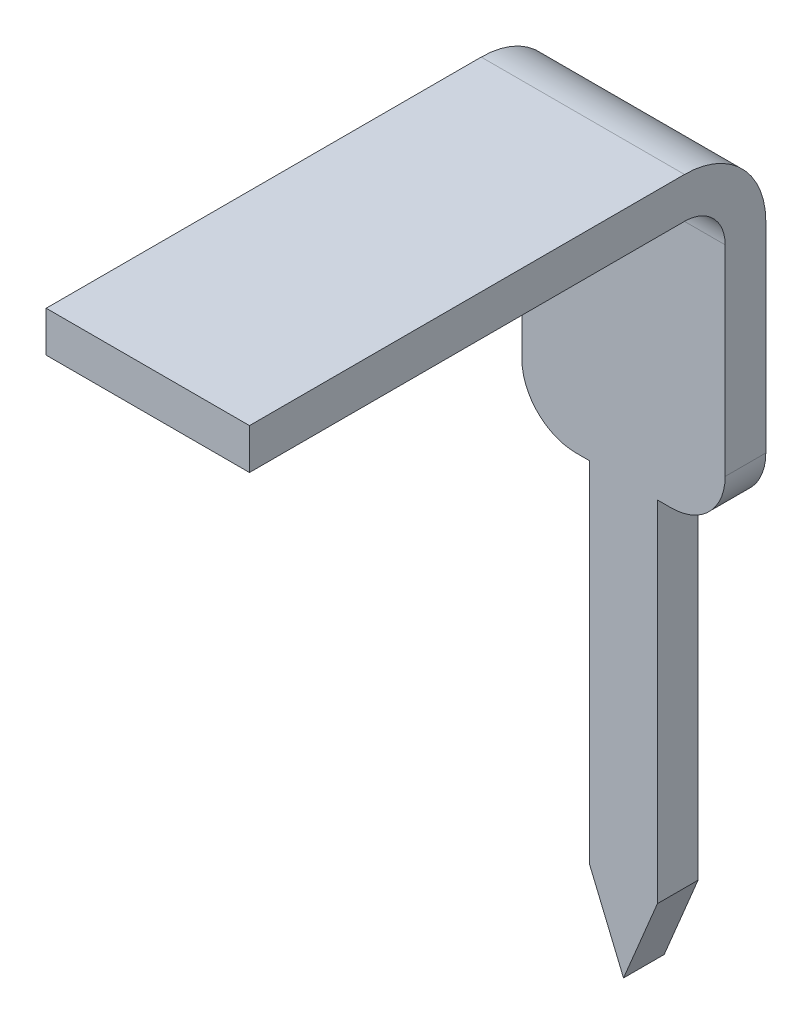
ISO-10303-21;
HEADER;
FILE_DESCRIPTION(('STEP AP214'),'2;1');
FILE_NAME('part.step','',(''),(''),'','','');
FILE_SCHEMA(('AUTOMOTIVE_DESIGN { 1 0 10303 214 1 1 1 1 }'));
ENDSEC;
DATA;
#1=APPLICATION_CONTEXT('core data for automotive mechanical design processes');
#2=APPLICATION_PROTOCOL_DEFINITION('international standard','automotive_design',2000,#1);
#3=PRODUCT_CONTEXT('',#1,'mechanical');
#4=PRODUCT('Part','Part','',(#3));
#5=PRODUCT_RELATED_PRODUCT_CATEGORY('part','',(#4));
#6=PRODUCT_DEFINITION_FORMATION('','',#4);
#7=PRODUCT_DEFINITION_CONTEXT('part definition',#1,'design');
#8=PRODUCT_DEFINITION('design','',#6,#7);
#9=PRODUCT_DEFINITION_SHAPE('','',#8);
#10=(LENGTH_UNIT() NAMED_UNIT(*) SI_UNIT(.MILLI.,.METRE.));
#11=(NAMED_UNIT(*) PLANE_ANGLE_UNIT() SI_UNIT($,.RADIAN.));
#12=(NAMED_UNIT(*) SI_UNIT($,.STERADIAN.) SOLID_ANGLE_UNIT());
#13=UNCERTAINTY_MEASURE_WITH_UNIT(LENGTH_MEASURE(1.E-05),#10,'distance_accuracy_value','');
#14=(GEOMETRIC_REPRESENTATION_CONTEXT(3) GLOBAL_UNCERTAINTY_ASSIGNED_CONTEXT((#13)) GLOBAL_UNIT_ASSIGNED_CONTEXT((#10,
#11,#12)) REPRESENTATION_CONTEXT('',''));
#15=CARTESIAN_POINT('',(0.,0.,0.));
#16=DIRECTION('',(0.,0.,1.));
#17=DIRECTION('',(1.,0.,0.));
#18=AXIS2_PLACEMENT_3D('',#15,#16,#17);
#19=CARTESIAN_POINT('',(2.78,-0.299999999999998,-0.170000000000001));
#20=DIRECTION('',(0.,0.,-1.));
#21=DIRECTION('',(-1.,0.,0.));
#22=AXIS2_PLACEMENT_3D('',#19,#20,#21);
#23=PLANE('',#22);
#24=DIRECTION('',(-1.,0.,0.));
#25=VECTOR('',#24,1.);
#26=CARTESIAN_POINT('',(2.78,-2.48,-0.170000000000001));
#27=LINE('',#26,#25);
#28=CARTESIAN_POINT('',(1.78,-2.48,-0.17));
#29=VERTEX_POINT('',#28);
#30=CARTESIAN_POINT('',(1.68,-2.48,-0.170000000000001));
#31=VERTEX_POINT('',#30);
#32=EDGE_CURVE('E100',#29,#31,#27,.T.);
#33=ORIENTED_EDGE('',*,*,#32,.F.);
#34=DIRECTION('',(0.,1.,0.));
#35=VECTOR('',#34,1.);
#36=CARTESIAN_POINT('',(1.78,-5.06,-0.17));
#37=LINE('',#36,#35);
#38=CARTESIAN_POINT('',(1.78,-5.06,-0.17));
#39=VERTEX_POINT('',#38);
#40=EDGE_CURVE('E132',#39,#29,#37,.T.);
#41=ORIENTED_EDGE('',*,*,#40,.F.);
#42=DIRECTION('',(0.384615384615385,-0.923076923076923,0.));
#43=VECTOR('',#42,1.);
#44=CARTESIAN_POINT('',(2.03,-5.66,-0.17));
#45=LINE('',#44,#43);
#46=CARTESIAN_POINT('',(2.03,-5.66,-0.17));
#47=VERTEX_POINT('',#46);
#48=EDGE_CURVE('E128',#47,#39,#45,.F.);
#49=ORIENTED_EDGE('',*,*,#48,.F.);
#50=DIRECTION('',(0.384615384615385,0.923076923076923,0.));
#51=VECTOR('',#50,1.);
#52=CARTESIAN_POINT('',(2.28,-5.06,-0.17));
#53=LINE('',#52,#51);
#54=CARTESIAN_POINT('',(2.28,-5.06,-0.17));
#55=VERTEX_POINT('',#54);
#56=EDGE_CURVE('E171',#55,#47,#53,.F.);
#57=ORIENTED_EDGE('',*,*,#56,.F.);
#58=DIRECTION('',(0.,1.,0.));
#59=VECTOR('',#58,1.);
#60=CARTESIAN_POINT('',(2.28,-2.48,-0.17));
#61=LINE('',#60,#59);
#62=CARTESIAN_POINT('',(2.28,-2.48,-0.17));
#63=VERTEX_POINT('',#62);
#64=EDGE_CURVE('E96',#63,#55,#61,.F.);
#65=ORIENTED_EDGE('',*,*,#64,.F.);
#66=DIRECTION('',(-1.,0.,0.));
#67=VECTOR('',#66,1.);
#68=CARTESIAN_POINT('',(2.78,-2.48,-0.170000000000001));
#69=LINE('',#68,#67);
#70=CARTESIAN_POINT('',(2.38,-2.48,-0.170000000000001));
#71=VERTEX_POINT('',#70);
#72=EDGE_CURVE('E91',#71,#63,#69,.T.);
#73=ORIENTED_EDGE('',*,*,#72,.F.);
#74=CARTESIAN_POINT('',(2.38,-2.08,-0.17));
#75=DIRECTION('',(0.,0.,-1.));
#76=DIRECTION('',(-1.,0.,0.));
#77=AXIS2_PLACEMENT_3D('',#74,#75,#76);
#78=CIRCLE('',#77,0.4);
#79=CARTESIAN_POINT('',(2.78,-2.08,-0.170000000000001));
#80=VERTEX_POINT('',#79);
#81=EDGE_CURVE('E18',#80,#71,#78,.T.);
#82=ORIENTED_EDGE('',*,*,#81,.F.);
#83=DIRECTION('',(0.,1.,0.));
#84=VECTOR('',#83,1.);
#85=CARTESIAN_POINT('',(2.78,-0.299999999999998,-0.170000000000001));
#86=LINE('',#85,#84);
#87=CARTESIAN_POINT('',(2.78,-0.599999999999998,-0.170000000000001));
#88=VERTEX_POINT('',#87);
#89=EDGE_CURVE('E117',#88,#80,#86,.F.);
#90=ORIENTED_EDGE('',*,*,#89,.F.);
#91=DIRECTION('',(-1.,0.,0.));
#92=VECTOR('',#91,1.);
#93=CARTESIAN_POINT('',(2.78,-0.599999999999999,-0.170000000000001));
#94=LINE('',#93,#92);
#95=CARTESIAN_POINT('',(1.28,-0.599999999999999,-0.170000000000001));
#96=VERTEX_POINT('',#95);
#97=EDGE_CURVE('E118',#96,#88,#94,.F.);
#98=ORIENTED_EDGE('',*,*,#97,.F.);
#99=DIRECTION('',(0.,1.,0.));
#100=VECTOR('',#99,1.);
#101=CARTESIAN_POINT('',(1.28,-0.299999999999998,-0.170000000000001));
#102=LINE('',#101,#100);
#103=CARTESIAN_POINT('',(1.28,-2.08,-0.170000000000001));
#104=VERTEX_POINT('',#103);
#105=EDGE_CURVE('E121',#104,#96,#102,.T.);
#106=ORIENTED_EDGE('',*,*,#105,.F.);
#107=CARTESIAN_POINT('',(1.68,-2.08,-0.17));
#108=DIRECTION('',(0.,0.,-1.));
#109=DIRECTION('',(-1.,0.,0.));
#110=AXIS2_PLACEMENT_3D('',#107,#108,#109);
#111=CIRCLE('',#110,0.4);
#112=EDGE_CURVE('E154',#31,#104,#111,.T.);
#113=ORIENTED_EDGE('',*,*,#112,.F.);
#114=EDGE_LOOP('',(#33,#41,#49,#57,#65,#73,#82,#90,#98,#106,#113));
#115=FACE_BOUND('',#114,.T.);
#116=ADVANCED_FACE('F15',(#115),#23,.F.);
#117=CARTESIAN_POINT('',(1.78,-5.06,-0.47));
#118=DIRECTION('',(-1.,0.,0.));
#119=DIRECTION('',(0.,0.,1.));
#120=AXIS2_PLACEMENT_3D('',#117,#118,#119);
#121=PLANE('',#120);
#122=DIRECTION('',(0.,1.,0.));
#123=VECTOR('',#122,1.);
#124=CARTESIAN_POINT('',(1.78,-0.149999999999999,-0.47));
#125=LINE('',#124,#123);
#126=CARTESIAN_POINT('',(1.78,-2.48,-0.47));
#127=VERTEX_POINT('',#126);
#128=CARTESIAN_POINT('',(1.78,-5.06,-0.47));
#129=VERTEX_POINT('',#128);
#130=EDGE_CURVE('E188',#127,#129,#125,.F.);
#131=ORIENTED_EDGE('',*,*,#130,.T.);
#132=DIRECTION('',(0.,0.,1.));
#133=VECTOR('',#132,1.);
#134=CARTESIAN_POINT('',(1.78,-5.06,-0.47));
#135=LINE('',#134,#133);
#136=EDGE_CURVE('E131',#39,#129,#135,.F.);
#137=ORIENTED_EDGE('',*,*,#136,.F.);
#138=ORIENTED_EDGE('',*,*,#40,.T.);
#139=DIRECTION('',(0.,0.,-1.));
#140=VECTOR('',#139,1.);
#141=CARTESIAN_POINT('',(1.78,-2.48,-0.47));
#142=LINE('',#141,#140);
#143=EDGE_CURVE('E183',#127,#29,#142,.F.);
#144=ORIENTED_EDGE('',*,*,#143,.F.);
#145=EDGE_LOOP('',(#131,#137,#138,#144));
#146=FACE_BOUND('',#145,.T.);
#147=ADVANCED_FACE('F311',(#146),#121,.T.);
#148=CARTESIAN_POINT('',(2.03,-5.66,-0.47));
#149=DIRECTION('',(-0.923076923076923,-0.384615384615385,0.));
#150=DIRECTION('',(0.384615384615385,-0.923076923076923,0.));
#151=AXIS2_PLACEMENT_3D('',#148,#149,#150);
#152=PLANE('',#151);
#153=DIRECTION('',(0.384615384615384,-0.923076923076923,0.));
#154=VECTOR('',#153,1.);
#155=CARTESIAN_POINT('',(1.78,-5.06,-0.47));
#156=LINE('',#155,#154);
#157=CARTESIAN_POINT('',(2.03,-5.66,-0.47));
#158=VERTEX_POINT('',#157);
#159=EDGE_CURVE('E191',#129,#158,#156,.T.);
#160=ORIENTED_EDGE('',*,*,#159,.T.);
#161=DIRECTION('',(0.,0.,1.));
#162=VECTOR('',#161,1.);
#163=CARTESIAN_POINT('',(2.03,-5.66,-0.47));
#164=LINE('',#163,#162);
#165=EDGE_CURVE('E174',#47,#158,#164,.F.);
#166=ORIENTED_EDGE('',*,*,#165,.F.);
#167=ORIENTED_EDGE('',*,*,#48,.T.);
#168=ORIENTED_EDGE('',*,*,#136,.T.);
#169=EDGE_LOOP('',(#160,#166,#167,#168));
#170=FACE_BOUND('',#169,.T.);
#171=ADVANCED_FACE('F332',(#170),#152,.T.);
#172=CARTESIAN_POINT('',(2.28,-5.06,-0.47));
#173=DIRECTION('',(0.923076923076923,-0.384615384615385,0.));
#174=DIRECTION('',(0.384615384615385,0.923076923076923,0.));
#175=AXIS2_PLACEMENT_3D('',#172,#173,#174);
#176=PLANE('',#175);
#177=DIRECTION('',(0.384615384615385,0.923076923076923,0.));
#178=VECTOR('',#177,1.);
#179=CARTESIAN_POINT('',(2.03,-5.66,-0.47));
#180=LINE('',#179,#178);
#181=CARTESIAN_POINT('',(2.28,-5.06,-0.47));
#182=VERTEX_POINT('',#181);
#183=EDGE_CURVE('E201',#158,#182,#180,.T.);
#184=ORIENTED_EDGE('',*,*,#183,.T.);
#185=DIRECTION('',(0.,0.,-1.));
#186=VECTOR('',#185,1.);
#187=CARTESIAN_POINT('',(2.28,-5.06,-0.47));
#188=LINE('',#187,#186);
#189=EDGE_CURVE('E180',#55,#182,#188,.T.);
#190=ORIENTED_EDGE('',*,*,#189,.F.);
#191=ORIENTED_EDGE('',*,*,#56,.T.);
#192=ORIENTED_EDGE('',*,*,#165,.T.);
#193=EDGE_LOOP('',(#184,#190,#191,#192));
#194=FACE_BOUND('',#193,.T.);
#195=ADVANCED_FACE('F330',(#194),#176,.T.);
#196=CARTESIAN_POINT('',(2.28,-2.48,-0.47));
#197=DIRECTION('',(1.,0.,0.));
#198=DIRECTION('',(0.,0.,-1.));
#199=AXIS2_PLACEMENT_3D('',#196,#197,#198);
#200=PLANE('',#199);
#201=DIRECTION('',(0.,1.,0.));
#202=VECTOR('',#201,1.);
#203=CARTESIAN_POINT('',(2.28,-0.149999999999999,-0.47));
#204=LINE('',#203,#202);
#205=CARTESIAN_POINT('',(2.28,-2.48,-0.47));
#206=VERTEX_POINT('',#205);
#207=EDGE_CURVE('E210',#182,#206,#204,.T.);
#208=ORIENTED_EDGE('',*,*,#207,.T.);
#209=DIRECTION('',(0.,0.,-1.));
#210=VECTOR('',#209,1.);
#211=CARTESIAN_POINT('',(2.28,-2.48,-0.47));
#212=LINE('',#211,#210);
#213=EDGE_CURVE('E185',#63,#206,#212,.T.);
#214=ORIENTED_EDGE('',*,*,#213,.F.);
#215=ORIENTED_EDGE('',*,*,#64,.T.);
#216=ORIENTED_EDGE('',*,*,#189,.T.);
#217=EDGE_LOOP('',(#208,#214,#215,#216));
#218=FACE_BOUND('',#217,.T.);
#219=ADVANCED_FACE('F324',(#218),#200,.T.);
#220=CARTESIAN_POINT('',(1.78,-2.48,-0.47));
#221=DIRECTION('',(0.,-1.,0.));
#222=DIRECTION('',(0.,0.,-1.));
#223=AXIS2_PLACEMENT_3D('',#220,#221,#222);
#224=PLANE('',#223);
#225=DIRECTION('',(1.,0.,0.));
#226=VECTOR('',#225,1.);
#227=CARTESIAN_POINT('',(2.03,-2.48,-0.47));
#228=LINE('',#227,#226);
#229=CARTESIAN_POINT('',(1.68,-2.48,-0.47));
#230=VERTEX_POINT('',#229);
#231=EDGE_CURVE('E192',#230,#127,#228,.T.);
#232=ORIENTED_EDGE('',*,*,#231,.T.);
#233=ORIENTED_EDGE('',*,*,#143,.T.);
#234=ORIENTED_EDGE('',*,*,#32,.T.);
#235=DIRECTION('',(0.,0.,-1.));
#236=VECTOR('',#235,1.);
#237=CARTESIAN_POINT('',(1.68,-2.48,-0.47));
#238=LINE('',#237,#236);
#239=EDGE_CURVE('E152',#230,#31,#238,.F.);
#240=ORIENTED_EDGE('',*,*,#239,.F.);
#241=EDGE_LOOP('',(#232,#233,#234,#240));
#242=FACE_BOUND('',#241,.T.);
#243=ADVANCED_FACE('F299',(#242),#224,.T.);
#244=CARTESIAN_POINT('',(2.38,-2.48,-0.47));
#245=DIRECTION('',(0.,-1.,0.));
#246=DIRECTION('',(0.,0.,-1.));
#247=AXIS2_PLACEMENT_3D('',#244,#245,#246);
#248=PLANE('',#247);
#249=DIRECTION('',(1.,0.,0.));
#250=VECTOR('',#249,1.);
#251=CARTESIAN_POINT('',(2.03,-2.48,-0.47));
#252=LINE('',#251,#250);
#253=CARTESIAN_POINT('',(2.38,-2.48,-0.47));
#254=VERTEX_POINT('',#253);
#255=EDGE_CURVE('E106',#206,#254,#252,.T.);
#256=ORIENTED_EDGE('',*,*,#255,.T.);
#257=DIRECTION('',(0.,0.,-1.));
#258=VECTOR('',#257,1.);
#259=CARTESIAN_POINT('',(2.38,-2.48,-0.47));
#260=LINE('',#259,#258);
#261=EDGE_CURVE('E103',#71,#254,#260,.T.);
#262=ORIENTED_EDGE('',*,*,#261,.F.);
#263=ORIENTED_EDGE('',*,*,#72,.T.);
#264=ORIENTED_EDGE('',*,*,#213,.T.);
#265=EDGE_LOOP('',(#256,#262,#263,#264));
#266=FACE_BOUND('',#265,.T.);
#267=ADVANCED_FACE('F104',(#266),#248,.T.);
#268=CARTESIAN_POINT('',(2.03,-0.149999999999999,-0.47));
#269=DIRECTION('',(0.,0.,1.));
#270=DIRECTION('',(1.,0.,0.));
#271=AXIS2_PLACEMENT_3D('',#268,#269,#270);
#272=PLANE('',#271);
#273=DIRECTION('',(0.,1.,0.));
#274=VECTOR('',#273,1.);
#275=CARTESIAN_POINT('',(1.28,0.,-0.47));
#276=LINE('',#275,#274);
#277=CARTESIAN_POINT('',(1.28,-2.08,-0.47));
#278=VERTEX_POINT('',#277);
#279=CARTESIAN_POINT('',(1.28,-0.6,-0.47));
#280=VERTEX_POINT('',#279);
#281=EDGE_CURVE('E148',#278,#280,#276,.T.);
#282=ORIENTED_EDGE('',*,*,#281,.T.);
#283=DIRECTION('',(-1.,0.,0.));
#284=VECTOR('',#283,1.);
#285=CARTESIAN_POINT('',(2.405,-0.6,-0.47));
#286=LINE('',#285,#284);
#287=CARTESIAN_POINT('',(2.78,-0.6,-0.47));
#288=VERTEX_POINT('',#287);
#289=EDGE_CURVE('E223',#288,#280,#286,.T.);
#290=ORIENTED_EDGE('',*,*,#289,.F.);
#291=DIRECTION('',(0.,1.,0.));
#292=VECTOR('',#291,1.);
#293=CARTESIAN_POINT('',(2.78,-0.149999999999999,-0.47));
#294=LINE('',#293,#292);
#295=CARTESIAN_POINT('',(2.78,-2.08,-0.47));
#296=VERTEX_POINT('',#295);
#297=EDGE_CURVE('E153',#296,#288,#294,.T.);
#298=ORIENTED_EDGE('',*,*,#297,.F.);
#299=CARTESIAN_POINT('',(2.38,-2.08,-0.47));
#300=DIRECTION('',(0.,0.,-1.));
#301=DIRECTION('',(-1.,0.,0.));
#302=AXIS2_PLACEMENT_3D('',#299,#300,#301);
#303=CIRCLE('',#302,0.4);
#304=EDGE_CURVE('E110',#254,#296,#303,.F.);
#305=ORIENTED_EDGE('',*,*,#304,.F.);
#306=ORIENTED_EDGE('',*,*,#255,.F.);
#307=ORIENTED_EDGE('',*,*,#207,.F.);
#308=ORIENTED_EDGE('',*,*,#183,.F.);
#309=ORIENTED_EDGE('',*,*,#159,.F.);
#310=ORIENTED_EDGE('',*,*,#130,.F.);
#311=ORIENTED_EDGE('',*,*,#231,.F.);
#312=CARTESIAN_POINT('',(1.68,-2.08,-0.47));
#313=DIRECTION('',(0.,0.,-1.));
#314=DIRECTION('',(-1.,0.,0.));
#315=AXIS2_PLACEMENT_3D('',#312,#313,#314);
#316=CIRCLE('',#315,0.4);
#317=EDGE_CURVE('E150',#278,#230,#316,.F.);
#318=ORIENTED_EDGE('',*,*,#317,.F.);
#319=EDGE_LOOP('',(#282,#290,#298,#305,#306,#307,#308,#309,#310,#311,#318));
#320=FACE_BOUND('',#319,.T.);
#321=ADVANCED_FACE('F306',(#320),#272,.F.);
#322=CARTESIAN_POINT('',(1.68,-2.08,-0.47));
#323=DIRECTION('',(0.,0.,-1.));
#324=DIRECTION('',(-1.,0.,0.));
#325=AXIS2_PLACEMENT_3D('',#322,#323,#324);
#326=CYLINDRICAL_SURFACE('',#325,0.4);
#327=ORIENTED_EDGE('',*,*,#317,.T.);
#328=ORIENTED_EDGE('',*,*,#239,.T.);
#329=ORIENTED_EDGE('',*,*,#112,.T.);
#330=DIRECTION('',(0.,0.,-1.));
#331=VECTOR('',#330,1.);
#332=CARTESIAN_POINT('',(1.28,-2.08,0.));
#333=LINE('',#332,#331);
#334=EDGE_CURVE('E225',#104,#278,#333,.T.);
#335=ORIENTED_EDGE('',*,*,#334,.T.);
#336=EDGE_LOOP('',(#327,#328,#329,#335));
#337=FACE_BOUND('',#336,.T.);
#338=ADVANCED_FACE('F297',(#337),#326,.T.);
#339=CARTESIAN_POINT('',(2.78,0.,0.));
#340=DIRECTION('',(0.,-1.,0.));
#341=DIRECTION('',(0.,0.,-1.));
#342=AXIS2_PLACEMENT_3D('',#339,#340,#341);
#343=PLANE('',#342);
#344=DIRECTION('',(0.,0.,-1.));
#345=VECTOR('',#344,1.);
#346=CARTESIAN_POINT('',(1.28,0.,0.));
#347=LINE('',#346,#345);
#348=CARTESIAN_POINT('',(1.28,0.,0.13));
#349=VERTEX_POINT('',#348);
#350=CARTESIAN_POINT('',(1.28,0.,3.34));
#351=VERTEX_POINT('',#350);
#352=EDGE_CURVE('E147',#349,#351,#347,.F.);
#353=ORIENTED_EDGE('',*,*,#352,.T.);
#354=DIRECTION('',(1.,0.,0.));
#355=VECTOR('',#354,1.);
#356=CARTESIAN_POINT('',(2.03,0.,3.34));
#357=LINE('',#356,#355);
#358=CARTESIAN_POINT('',(2.78,0.,3.34));
#359=VERTEX_POINT('',#358);
#360=EDGE_CURVE('E238',#359,#351,#357,.F.);
#361=ORIENTED_EDGE('',*,*,#360,.F.);
#362=DIRECTION('',(0.,0.,1.));
#363=VECTOR('',#362,1.);
#364=CARTESIAN_POINT('',(2.78,0.,0.));
#365=LINE('',#364,#363);
#366=CARTESIAN_POINT('',(2.78,0.,0.13));
#367=VERTEX_POINT('',#366);
#368=EDGE_CURVE('E143',#359,#367,#365,.F.);
#369=ORIENTED_EDGE('',*,*,#368,.T.);
#370=DIRECTION('',(-1.,0.,0.));
#371=VECTOR('',#370,1.);
#372=CARTESIAN_POINT('',(2.405,0.,0.13));
#373=LINE('',#372,#371);
#374=EDGE_CURVE('E111',#349,#367,#373,.F.);
#375=ORIENTED_EDGE('',*,*,#374,.F.);
#376=EDGE_LOOP('',(#353,#361,#369,#375));
#377=FACE_BOUND('',#376,.T.);
#378=ADVANCED_FACE('F277',(#377),#343,.F.);
#379=CARTESIAN_POINT('',(2.405,-0.6,0.13));
#380=DIRECTION('',(-1.,0.,0.));
#381=DIRECTION('',(0.,0.,1.));
#382=AXIS2_PLACEMENT_3D('',#379,#380,#381);
#383=CYLINDRICAL_SURFACE('',#382,0.6);
#384=CARTESIAN_POINT('',(1.28,-0.6,0.13));
#385=DIRECTION('',(-1.,0.,0.));
#386=DIRECTION('',(0.,0.,1.));
#387=AXIS2_PLACEMENT_3D('',#384,#385,#386);
#388=CIRCLE('',#387,0.6);
#389=EDGE_CURVE('E144',#280,#349,#388,.F.);
#390=ORIENTED_EDGE('',*,*,#389,.T.);
#391=ORIENTED_EDGE('',*,*,#374,.T.);
#392=CARTESIAN_POINT('',(2.78,-0.6,0.13));
#393=DIRECTION('',(-1.,0.,0.));
#394=DIRECTION('',(0.,0.,1.));
#395=AXIS2_PLACEMENT_3D('',#392,#393,#394);
#396=CIRCLE('',#395,0.6);
#397=EDGE_CURVE('E140',#367,#288,#396,.T.);
#398=ORIENTED_EDGE('',*,*,#397,.T.);
#399=ORIENTED_EDGE('',*,*,#289,.T.);
#400=EDGE_LOOP('',(#390,#391,#398,#399));
#401=FACE_BOUND('',#400,.T.);
#402=ADVANCED_FACE('F356',(#401),#383,.T.);
#403=CARTESIAN_POINT('',(2.38,-2.08,-0.47));
#404=DIRECTION('',(0.,0.,-1.));
#405=DIRECTION('',(-1.,0.,0.));
#406=AXIS2_PLACEMENT_3D('',#403,#404,#405);
#407=CYLINDRICAL_SURFACE('',#406,0.4);
#408=ORIENTED_EDGE('',*,*,#304,.T.);
#409=DIRECTION('',(0.,0.,1.));
#410=VECTOR('',#409,1.);
#411=CARTESIAN_POINT('',(2.78,-2.08,0.));
#412=LINE('',#411,#410);
#413=EDGE_CURVE('E115',#296,#80,#412,.T.);
#414=ORIENTED_EDGE('',*,*,#413,.T.);
#415=ORIENTED_EDGE('',*,*,#81,.T.);
#416=ORIENTED_EDGE('',*,*,#261,.T.);
#417=EDGE_LOOP('',(#408,#414,#415,#416));
#418=FACE_BOUND('',#417,.T.);
#419=ADVANCED_FACE('F113',(#418),#407,.T.);
#420=CARTESIAN_POINT('',(1.28,0.,0.));
#421=DIRECTION('',(1.,0.,0.));
#422=DIRECTION('',(0.,0.,-1.));
#423=AXIS2_PLACEMENT_3D('',#420,#421,#422);
#424=PLANE('',#423);
#425=ORIENTED_EDGE('',*,*,#105,.T.);
#426=CARTESIAN_POINT('',(1.28,-0.599999999999998,0.129999999999999));
#427=DIRECTION('',(1.,0.,0.));
#428=DIRECTION('',(0.,1.,0.));
#429=AXIS2_PLACEMENT_3D('',#426,#427,#428);
#430=CIRCLE('',#429,0.3);
#431=CARTESIAN_POINT('',(1.28,-0.299999999999999,0.129999999999999));
#432=VERTEX_POINT('',#431);
#433=EDGE_CURVE('E137',#96,#432,#430,.T.);
#434=ORIENTED_EDGE('',*,*,#433,.T.);
#435=DIRECTION('',(0.,0.,1.));
#436=VECTOR('',#435,1.);
#437=CARTESIAN_POINT('',(1.28,-0.299999999999999,0.));
#438=LINE('',#437,#436);
#439=CARTESIAN_POINT('',(1.28,-0.299999999999999,3.34));
#440=VERTEX_POINT('',#439);
#441=EDGE_CURVE('E136',#432,#440,#438,.T.);
#442=ORIENTED_EDGE('',*,*,#441,.T.);
#443=DIRECTION('',(0.,1.,0.));
#444=VECTOR('',#443,1.);
#445=CARTESIAN_POINT('',(1.28,-0.149999999999999,3.34));
#446=LINE('',#445,#444);
#447=EDGE_CURVE('E227',#351,#440,#446,.F.);
#448=ORIENTED_EDGE('',*,*,#447,.F.);
#449=ORIENTED_EDGE('',*,*,#352,.F.);
#450=ORIENTED_EDGE('',*,*,#389,.F.);
#451=ORIENTED_EDGE('',*,*,#281,.F.);
#452=ORIENTED_EDGE('',*,*,#334,.F.);
#453=EDGE_LOOP('',(#425,#434,#442,#448,#449,#450,#451,#452));
#454=FACE_BOUND('',#453,.T.);
#455=ADVANCED_FACE('F291',(#454),#424,.F.);
#456=CARTESIAN_POINT('',(2.03,-0.149999999999999,3.34));
#457=DIRECTION('',(0.,0.,1.));
#458=DIRECTION('',(1.,0.,0.));
#459=AXIS2_PLACEMENT_3D('',#456,#457,#458);
#460=PLANE('',#459);
#461=DIRECTION('',(0.,1.,0.));
#462=VECTOR('',#461,1.);
#463=CARTESIAN_POINT('',(2.78,-0.299999999999998,3.34));
#464=LINE('',#463,#462);
#465=CARTESIAN_POINT('',(2.78,-0.299999999999999,3.34));
#466=VERTEX_POINT('',#465);
#467=EDGE_CURVE('E241',#466,#359,#464,.T.);
#468=ORIENTED_EDGE('',*,*,#467,.T.);
#469=ORIENTED_EDGE('',*,*,#360,.T.);
#470=ORIENTED_EDGE('',*,*,#447,.T.);
#471=DIRECTION('',(1.,0.,0.));
#472=VECTOR('',#471,1.);
#473=CARTESIAN_POINT('',(1.28,-0.299999999999999,3.34));
#474=LINE('',#473,#472);
#475=EDGE_CURVE('E254',#440,#466,#474,.T.);
#476=ORIENTED_EDGE('',*,*,#475,.T.);
#477=EDGE_LOOP('',(#468,#469,#470,#476));
#478=FACE_BOUND('',#477,.T.);
#479=ADVANCED_FACE('F284',(#478),#460,.T.);
#480=CARTESIAN_POINT('',(2.78,-0.299999999999998,0.));
#481=DIRECTION('',(-1.,0.,0.));
#482=DIRECTION('',(0.,0.,1.));
#483=AXIS2_PLACEMENT_3D('',#480,#481,#482);
#484=PLANE('',#483);
#485=ORIENTED_EDGE('',*,*,#297,.T.);
#486=ORIENTED_EDGE('',*,*,#397,.F.);
#487=ORIENTED_EDGE('',*,*,#368,.F.);
#488=ORIENTED_EDGE('',*,*,#467,.F.);
#489=DIRECTION('',(0.,0.,1.));
#490=VECTOR('',#489,1.);
#491=CARTESIAN_POINT('',(2.78,-0.299999999999999,0.));
#492=LINE('',#491,#490);
#493=CARTESIAN_POINT('',(2.78,-0.299999999999999,0.129999999999999));
#494=VERTEX_POINT('',#493);
#495=EDGE_CURVE('E24',#466,#494,#492,.F.);
#496=ORIENTED_EDGE('',*,*,#495,.T.);
#497=CARTESIAN_POINT('',(2.78,-0.599999999999998,0.129999999999999));
#498=DIRECTION('',(1.,0.,0.));
#499=DIRECTION('',(0.,1.,0.));
#500=AXIS2_PLACEMENT_3D('',#497,#498,#499);
#501=CIRCLE('',#500,0.3);
#502=EDGE_CURVE('E32',#494,#88,#501,.F.);
#503=ORIENTED_EDGE('',*,*,#502,.T.);
#504=ORIENTED_EDGE('',*,*,#89,.T.);
#505=ORIENTED_EDGE('',*,*,#413,.F.);
#506=EDGE_LOOP('',(#485,#486,#487,#488,#496,#503,#504,#505));
#507=FACE_BOUND('',#506,.T.);
#508=ADVANCED_FACE('F280',(#507),#484,.F.);
#509=CARTESIAN_POINT('',(2.03,-0.599999999999998,0.129999999999999));
#510=DIRECTION('',(1.,0.,0.));
#511=DIRECTION('',(0.,1.,0.));
#512=AXIS2_PLACEMENT_3D('',#509,#510,#511);
#513=CYLINDRICAL_SURFACE('',#512,0.3);
#514=DIRECTION('',(1.,0.,0.));
#515=VECTOR('',#514,1.);
#516=CARTESIAN_POINT('',(1.28,-0.299999999999999,0.129999999999999));
#517=LINE('',#516,#515);
#518=EDGE_CURVE('E10',#494,#432,#517,.F.);
#519=ORIENTED_EDGE('',*,*,#518,.T.);
#520=ORIENTED_EDGE('',*,*,#433,.F.);
#521=ORIENTED_EDGE('',*,*,#97,.T.);
#522=ORIENTED_EDGE('',*,*,#502,.F.);
#523=EDGE_LOOP('',(#519,#520,#521,#522));
#524=FACE_BOUND('',#523,.T.);
#525=ADVANCED_FACE('F294',(#524),#513,.F.);
#526=CARTESIAN_POINT('',(1.28,-0.299999999999999,0.));
#527=DIRECTION('',(0.,1.,0.));
#528=DIRECTION('',(0.,0.,1.));
#529=AXIS2_PLACEMENT_3D('',#526,#527,#528);
#530=PLANE('',#529);
#531=ORIENTED_EDGE('',*,*,#495,.F.);
#532=ORIENTED_EDGE('',*,*,#475,.F.);
#533=ORIENTED_EDGE('',*,*,#441,.F.);
#534=ORIENTED_EDGE('',*,*,#518,.F.);
#535=EDGE_LOOP('',(#531,#532,#533,#534));
#536=FACE_BOUND('',#535,.T.);
#537=ADVANCED_FACE('F288',(#536),#530,.F.);
#538=CLOSED_SHELL('',(#116,#147,#171,#195,#219,#243,#267,#321,#338,#378,#402,#419,#455,#479,
#508,#525,#537));
#539=MANIFOLD_SOLID_BREP('B1',#538);
#540=ADVANCED_BREP_SHAPE_REPRESENTATION('',(#18,#539),#14);
#541=SHAPE_DEFINITION_REPRESENTATION(#9,#540);
ENDSEC;
END-ISO-10303-21;
